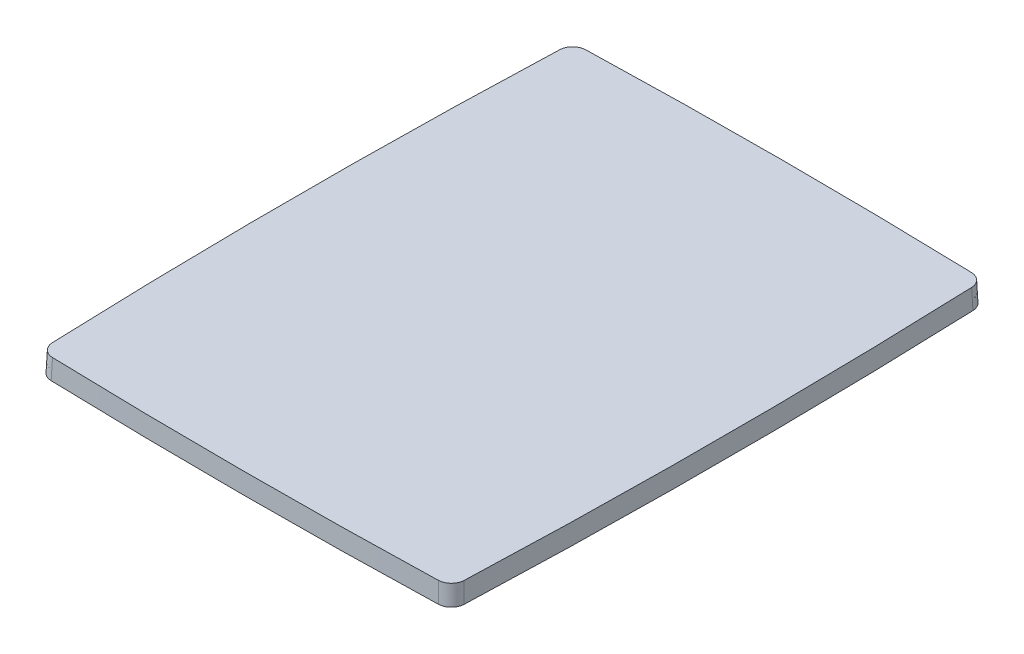
ISO-10303-21;
HEADER;
FILE_DESCRIPTION(('STEP AP214'),'2;1');
FILE_NAME('part.step','',(''),(''),'','','');
FILE_SCHEMA(('AUTOMOTIVE_DESIGN { 1 0 10303 214 1 1 1 1 }'));
ENDSEC;
DATA;
#1=APPLICATION_CONTEXT('core data for automotive mechanical design processes');
#2=APPLICATION_PROTOCOL_DEFINITION('international standard','automotive_design',2000,#1);
#3=PRODUCT_CONTEXT('',#1,'mechanical');
#4=PRODUCT('Part','Part','',(#3));
#5=PRODUCT_RELATED_PRODUCT_CATEGORY('part','',(#4));
#6=PRODUCT_DEFINITION_FORMATION('','',#4);
#7=PRODUCT_DEFINITION_CONTEXT('part definition',#1,'design');
#8=PRODUCT_DEFINITION('design','',#6,#7);
#9=PRODUCT_DEFINITION_SHAPE('','',#8);
#10=(LENGTH_UNIT() NAMED_UNIT(*) SI_UNIT(.MILLI.,.METRE.));
#11=(NAMED_UNIT(*) PLANE_ANGLE_UNIT() SI_UNIT($,.RADIAN.));
#12=(NAMED_UNIT(*) SI_UNIT($,.STERADIAN.) SOLID_ANGLE_UNIT());
#13=UNCERTAINTY_MEASURE_WITH_UNIT(LENGTH_MEASURE(1.E-05),#10,'distance_accuracy_value','');
#14=(GEOMETRIC_REPRESENTATION_CONTEXT(3) GLOBAL_UNCERTAINTY_ASSIGNED_CONTEXT((#13)) GLOBAL_UNIT_ASSIGNED_CONTEXT((#10,
#11,#12)) REPRESENTATION_CONTEXT('',''));
#15=CARTESIAN_POINT('',(0.,0.,0.));
#16=DIRECTION('',(0.,0.,1.));
#17=DIRECTION('',(1.,0.,0.));
#18=AXIS2_PLACEMENT_3D('',#15,#16,#17);
#19=CARTESIAN_POINT('',(0.,0.,475.82));
#20=DIRECTION('',(0.,-1.,0.));
#21=DIRECTION('',(0.,0.,1.));
#22=AXIS2_PLACEMENT_3D('',#19,#20,#21);
#23=CONICAL_SURFACE('',#22,496.,0.0349065850398866);
#24=CARTESIAN_POINT('',(0.,1.5,475.82));
#25=DIRECTION('',(0.,1.,0.));
#26=DIRECTION('',(0.,0.,1.));
#27=AXIS2_PLACEMENT_3D('',#24,#25,#26);
#28=CIRCLE('',#27,495.947618845762);
#29=CARTESIAN_POINT('',(14.4155592053351,1.5,-19.9180682291598));
#30=VERTEX_POINT('',#29);
#31=CARTESIAN_POINT('',(-14.415559205335,1.5,-19.9180682291598));
#32=VERTEX_POINT('',#31);
#33=EDGE_CURVE('E134',#30,#32,#28,.T.);
#34=ORIENTED_EDGE('',*,*,#33,.F.);
#35=CARTESIAN_POINT('',(13.5023841720723,57.3634951500784,-17.0533460126451));
#36=CARTESIAN_POINT('',(13.4688479934822,57.3943815495132,-17.9929902199785));
#37=CARTESIAN_POINT('',(12.5289359465911,57.3634951500784,-18.0179152226585));
#38=CARTESIAN_POINT('',(13.8211198631584,47.9229065522577,-17.375666699754));
#39=CARTESIAN_POINT('',(13.7868473241712,47.959297928233,-18.3139167859002));
#40=CARTESIAN_POINT('',(12.8483225928231,47.9229065522577,-18.3395908921133));
#41=CARTESIAN_POINT('',(14.1395720900963,38.4822986723283,-17.6977000087956));
#42=CARTESIAN_POINT('',(14.1047569560554,38.5185669434554,-18.6347528273251));
#43=CARTESIAN_POINT('',(13.1674244703757,38.4822986723283,-18.6609804761328));
#44=CARTESIAN_POINT('',(14.7759159168737,19.6010449078014,-18.3411982454393));
#45=CARTESIAN_POINT('',(14.7400194638885,19.6371534748343,-19.2758630292112));
#46=CARTESIAN_POINT('',(13.8050650048137,19.6010449078014,-19.3031938326454));
#47=CARTESIAN_POINT('',(15.0938075167173,10.1603990232041,-18.6626631730455));
#48=CARTESIAN_POINT('',(15.0573758785474,10.1963851340502,-19.5961407609568));
#49=CARTESIAN_POINT('',(14.1236036617029,10.1603990232041,-19.6240176051424));
#50=CARTESIAN_POINT('',(15.7290363948796,-8.72093032069853,-19.3050310259384));
#51=CARTESIAN_POINT('',(15.6915381180894,-8.68510230801318,-20.2361405664043));
#52=CARTESIAN_POINT('',(14.7601240758893,-8.72093032069852,-20.265105702369));
#53=CARTESIAN_POINT('',(16.0463736731985,-18.1616137800039,-19.6259339512252));
#54=CARTESIAN_POINT('',(16.0083474255404,-18.1259061405192,-20.5558661547318));
#55=CARTESIAN_POINT('',(15.0781058331865,-18.1616137800039,-20.5853700270988));
#56=CARTESIAN_POINT('',(16.6805000580181,-37.0430178599246,-20.2671840211138));
#57=CARTESIAN_POINT('',(16.6414216044739,-37.0074667166142,-21.1947678837972));
#58=CARTESIAN_POINT('',(15.7135186132139,-37.0430178599246,-21.2253454352469));
#59=CARTESIAN_POINT('',(16.9972891645149,-46.4837384805401,-20.5875311657118));
#60=CARTESIAN_POINT('',(16.9576899037424,-46.448307090399,-21.5139474838743));
#61=CARTESIAN_POINT('',(16.0309496359401,-46.4837384805401,-21.5450565186615));
#62=CARTESIAN_POINT('',(17.3138072577306,-55.9244774089696,-20.9076035285343));
#63=CARTESIAN_POINT('',(17.2738689794106,-55.8945015052294,-21.8330370390336));
#64=CARTESIAN_POINT('',(16.3481083716655,-55.9244774089696,-21.8644940824025));
#65=(BOUNDED_SURFACE() B_SPLINE_SURFACE(3,2,((#35,#36,#37),(#38,#39,#40),(#41,#42,#43),(#44,#45,
#46),(#47,#48,#49),(#50,#51,#52),(#53,#54,#55),(#56,#57,#58),(#59,#60,#61),(#62,#63,#64)),
.UNSPECIFIED.,.F.,.F.,.F.) B_SPLINE_SURFACE_WITH_KNOTS((4,2,2,2,4),(3,3),(0.,28.3543337658623,
56.708667335095,85.0630009002829,113.4173346621),(0.,1.),
.UNSPECIFIED.) GEOMETRIC_REPRESENTATION_ITEM() RATIONAL_B_SPLINE_SURFACE(((1.,0.728355131684002,
1.),(1.,0.728786183443343,1.),(1.,0.729215556511889,1.),(1.,0.73007098314536,1.),(1.,
0.730497036710308,1.),(1.,0.731345862220471,1.),(1.,0.731768634165687,1.),(1.,0.732610933427498,
1.),(1.,0.73303046074407,1.),(1.,0.733448384238914,1.))) REPRESENTATION_ITEM('') SURFACE());
#66=CARTESIAN_POINT('',(12.5289359465911,57.3634951500784,-18.0179152226585));
#67=CARTESIAN_POINT('',(12.8483225928231,47.9229065522577,-18.3395908921133));
#68=CARTESIAN_POINT('',(13.1674244703757,38.4822986723283,-18.6609804761328));
#69=CARTESIAN_POINT('',(13.8050650048137,19.6010449078014,-19.3031938326454));
#70=CARTESIAN_POINT('',(14.1236036617029,10.1603990232041,-19.6240176051424));
#71=CARTESIAN_POINT('',(14.7601240758893,-8.72093032069853,-20.265105702369));
#72=CARTESIAN_POINT('',(15.0781058331865,-18.1616137800039,-20.5853700270988));
#73=CARTESIAN_POINT('',(15.7135186132139,-37.0430178599246,-21.2253454352469));
#74=CARTESIAN_POINT('',(16.0309496359401,-46.4837384805401,-21.5450565186615));
#75=CARTESIAN_POINT('',(16.3481083716655,-55.9244774089696,-21.8644940824025));
#76=B_SPLINE_CURVE_WITH_KNOTS('',3,(#66,#67,#68,#69,#70,#71,#72,#73,#74,#75),.UNSPECIFIED.,.F.,
.F.,(4,2,2,2,4),(0.,28.3543337658623,56.708667335095,85.0630009002829,113.4173346621),.UNSPECIFIED.);
#77=CARTESIAN_POINT('',(14.4661267472598,0.,-19.9689986445163));
#78=VERTEX_POINT('',#77);
#79=EDGE_CURVE('E11',#30,#78,#76,.T.);
#80=ORIENTED_EDGE('',*,*,#79,.T.);
#81=CARTESIAN_POINT('',(0.,0.,475.82));
#82=DIRECTION('',(0.,1.,0.));
#83=DIRECTION('',(0.,0.,1.));
#84=AXIS2_PLACEMENT_3D('',#81,#82,#83);
#85=CIRCLE('',#84,496.);
#86=CARTESIAN_POINT('',(-14.4661267472598,0.,-19.9689986445163));
#87=VERTEX_POINT('',#86);
#88=EDGE_CURVE('E136',#78,#87,#85,.T.);
#89=ORIENTED_EDGE('',*,*,#88,.T.);
#90=CARTESIAN_POINT('',(-12.5289359465911,57.3634951500784,-18.0179152226585));
#91=CARTESIAN_POINT('',(-13.4688479934823,57.3943815495132,-17.9929902199785));
#92=CARTESIAN_POINT('',(-13.5023841720723,57.3634951500784,-17.0533460126451));
#93=CARTESIAN_POINT('',(-12.8483225928231,47.9229065522577,-18.3395908921133));
#94=CARTESIAN_POINT('',(-13.7868473241712,47.959297928233,-18.3139167859001));
#95=CARTESIAN_POINT('',(-13.8211198631584,47.9229065522577,-17.375666699754));
#96=CARTESIAN_POINT('',(-13.1674244703757,38.4822986723283,-18.6609804761328));
#97=CARTESIAN_POINT('',(-14.1047569560554,38.5185669434554,-18.6347528273251));
#98=CARTESIAN_POINT('',(-14.1395720900963,38.4822986723283,-17.6977000087955));
#99=CARTESIAN_POINT('',(-13.8050650048137,19.6010449078014,-19.3031938326454));
#100=CARTESIAN_POINT('',(-14.7400194638885,19.6371534748343,-19.2758630292112));
#101=CARTESIAN_POINT('',(-14.7759159168738,19.6010449078014,-18.3411982454393));
#102=CARTESIAN_POINT('',(-14.1236036617029,10.1603990232041,-19.6240176051424));
#103=CARTESIAN_POINT('',(-15.0573758785474,10.1963851340502,-19.5961407609568));
#104=CARTESIAN_POINT('',(-15.0938075167173,10.1603990232041,-18.6626631730455));
#105=CARTESIAN_POINT('',(-14.7601240758893,-8.72093032069852,-20.265105702369));
#106=CARTESIAN_POINT('',(-15.6915381180894,-8.68510230801318,-20.2361405664043));
#107=CARTESIAN_POINT('',(-15.7290363948796,-8.72093032069852,-19.3050310259384));
#108=CARTESIAN_POINT('',(-15.0781058331865,-18.1616137800039,-20.5853700270988));
#109=CARTESIAN_POINT('',(-16.0083474255404,-18.1259061405191,-20.5558661547318));
#110=CARTESIAN_POINT('',(-16.0463736731985,-18.1616137800039,-19.6259339512252));
#111=CARTESIAN_POINT('',(-15.7135186132139,-37.0430178599246,-21.2253454352469));
#112=CARTESIAN_POINT('',(-16.6414216044739,-37.0074667166142,-21.1947678837972));
#113=CARTESIAN_POINT('',(-16.6805000580181,-37.0430178599246,-20.2671840211138));
#114=CARTESIAN_POINT('',(-16.0309496359401,-46.4837384805401,-21.5450565186615));
#115=CARTESIAN_POINT('',(-16.9576899037424,-46.448307090399,-21.5139474838743));
#116=CARTESIAN_POINT('',(-16.9972891645149,-46.4837384805401,-20.5875311657118));
#117=CARTESIAN_POINT('',(-16.3481083716655,-55.9244774089696,-21.8644940824025));
#118=CARTESIAN_POINT('',(-17.2738689794106,-55.8945015052293,-21.8330370390336));
#119=CARTESIAN_POINT('',(-17.3138072577306,-55.9244774089696,-20.9076035285343));
#120=(BOUNDED_SURFACE() B_SPLINE_SURFACE(3,2,((#90,#91,#92),(#93,#94,#95),(#96,#97,#98),(#99,
#100,#101),(#102,#103,#104),(#105,#106,#107),(#108,#109,#110),(#111,#112,#113),(#114,#115,#116),
(#117,#118,#119)),.UNSPECIFIED.,.F.,.F.,.F.) B_SPLINE_SURFACE_WITH_KNOTS((4,2,2,2,4),(3,3),(0.,
28.3543337658623,56.7086673350949,85.0630009002828,113.4173346621),(0.,1.),
.UNSPECIFIED.) GEOMETRIC_REPRESENTATION_ITEM() RATIONAL_B_SPLINE_SURFACE(((1.,0.728355131684002,
1.),(1.,0.728786183443343,1.),(1.,0.729215556511889,1.),(1.,0.73007098314536,1.),(1.,
0.730497036710308,1.),(1.,0.731345862220471,1.),(1.,0.731768634165687,1.),(1.,0.732610933427498,
1.),(1.,0.73303046074407,1.),(1.,0.733448384238914,1.))) REPRESENTATION_ITEM('') SURFACE());
#121=CARTESIAN_POINT('',(-16.3481083716655,-55.9244774089696,-21.8644940824025));
#122=CARTESIAN_POINT('',(-16.0309496359401,-46.48373848054,-21.5450565186615));
#123=CARTESIAN_POINT('',(-15.7135186132139,-37.0430178599245,-21.2253454352469));
#124=CARTESIAN_POINT('',(-15.0781058331865,-18.1616137800039,-20.5853700270988));
#125=CARTESIAN_POINT('',(-14.7601240758893,-8.72093032069853,-20.265105702369));
#126=CARTESIAN_POINT('',(-14.1236036617029,10.1603990232041,-19.6240176051424));
#127=CARTESIAN_POINT('',(-13.8050650048137,19.6010449078014,-19.3031938326454));
#128=CARTESIAN_POINT('',(-13.1674244703758,38.4822986723283,-18.6609804761328));
#129=CARTESIAN_POINT('',(-12.8483225928231,47.9229065522577,-18.3395908921133));
#130=CARTESIAN_POINT('',(-12.5289359465911,57.3634951500784,-18.0179152226585));
#131=B_SPLINE_CURVE_WITH_KNOTS('',3,(#121,#122,#123,#124,#125,#126,#127,#128,#129,#130),
.UNSPECIFIED.,.F.,.F.,(4,2,2,2,4),(0.,28.3543337618174,56.7086673270053,85.0630008962379,
113.4173346621),.UNSPECIFIED.);
#132=EDGE_CURVE('E46',#87,#32,#131,.T.);
#133=ORIENTED_EDGE('',*,*,#132,.T.);
#134=EDGE_LOOP('',(#34,#80,#89,#133));
#135=FACE_BOUND('',#134,.T.);
#136=ADVANCED_FACE('F33',(#135),#23,.T.);
#137=CARTESIAN_POINT('',(480.2,0.,0.));
#138=DIRECTION('',(0.,-1.,0.));
#139=DIRECTION('',(0.,0.,1.));
#140=AXIS2_PLACEMENT_3D('',#137,#138,#139);
#141=CONICAL_SURFACE('',#140,496.,0.0349065850398866);
#142=CARTESIAN_POINT('',(480.2,0.,0.));
#143=DIRECTION('',(0.,1.,0.));
#144=DIRECTION('',(0.,0.,1.));
#145=AXIS2_PLACEMENT_3D('',#142,#143,#144);
#146=CIRCLE('',#145,496.);
#147=CARTESIAN_POINT('',(-15.4356356049083,0.,-19.0083328705757));
#148=VERTEX_POINT('',#147);
#149=CARTESIAN_POINT('',(-15.4356356049082,0.,19.0083328705757));
#150=VERTEX_POINT('',#149);
#151=EDGE_CURVE('E132',#148,#150,#146,.T.);
#152=ORIENTED_EDGE('',*,*,#151,.T.);
#153=CARTESIAN_POINT('',(-13.5023841720723,57.3634951500785,17.0533460126451));
#154=CARTESIAN_POINT('',(-13.4688479934822,57.3943815495133,17.9929902199785));
#155=CARTESIAN_POINT('',(-12.5289359465911,57.3634951500785,18.0179152226585));
#156=CARTESIAN_POINT('',(-13.8211198631585,47.9229065522578,17.375666699754));
#157=CARTESIAN_POINT('',(-13.7868473241712,47.9592979282331,18.3139167859002));
#158=CARTESIAN_POINT('',(-12.8483225928231,47.9229065522577,18.3395908921133));
#159=CARTESIAN_POINT('',(-14.1395720900963,38.4822986723284,17.6977000087955));
#160=CARTESIAN_POINT('',(-14.1047569560554,38.5185669434554,18.6347528273251));
#161=CARTESIAN_POINT('',(-13.1674244703757,38.4822986723284,18.6609804761329));
#162=CARTESIAN_POINT('',(-14.7759159168737,19.6010449078014,18.3411982454393));
#163=CARTESIAN_POINT('',(-14.7400194638885,19.6371534748343,19.2758630292112));
#164=CARTESIAN_POINT('',(-13.8050650048137,19.6010449078014,19.3031938326454));
#165=CARTESIAN_POINT('',(-15.0938075167172,10.1603990232042,18.6626631730455));
#166=CARTESIAN_POINT('',(-15.0573758785474,10.1963851340502,19.5961407609568));
#167=CARTESIAN_POINT('',(-14.1236036617029,10.1603990232042,19.6240176051424));
#168=CARTESIAN_POINT('',(-15.7290363948796,-8.72093032069853,19.3050310259384));
#169=CARTESIAN_POINT('',(-15.6915381180894,-8.68510230801318,20.2361405664044));
#170=CARTESIAN_POINT('',(-14.7601240758893,-8.72093032069852,20.265105702369));
#171=CARTESIAN_POINT('',(-16.0463736731985,-18.1616137800039,19.6259339512252));
#172=CARTESIAN_POINT('',(-16.0083474255404,-18.1259061405191,20.5558661547318));
#173=CARTESIAN_POINT('',(-15.0781058331866,-18.1616137800039,20.5853700270988));
#174=CARTESIAN_POINT('',(-16.6805000580181,-37.0430178599246,20.2671840211138));
#175=CARTESIAN_POINT('',(-16.641421604474,-37.0074667166143,21.1947678837972));
#176=CARTESIAN_POINT('',(-15.7135186132139,-37.0430178599246,21.2253454352469));
#177=CARTESIAN_POINT('',(-16.9972891645149,-46.4837384805402,20.5875311657118));
#178=CARTESIAN_POINT('',(-16.9576899037424,-46.4483070903991,21.5139474838743));
#179=CARTESIAN_POINT('',(-16.0309496359402,-46.4837384805402,21.5450565186615));
#180=CARTESIAN_POINT('',(-17.3138072577305,-55.9244774089697,20.9076035285344));
#181=CARTESIAN_POINT('',(-17.2738689794106,-55.8945015052294,21.8330370390336));
#182=CARTESIAN_POINT('',(-16.3481083716655,-55.9244774089697,21.8644940824025));
#183=(BOUNDED_SURFACE() B_SPLINE_SURFACE(3,2,((#153,#154,#155),(#156,#157,#158),(#159,#160,
#161),(#162,#163,#164),(#165,#166,#167),(#168,#169,#170),(#171,#172,#173),(#174,#175,#176),
(#177,#178,#179),(#180,#181,#182)),.UNSPECIFIED.,.F.,.F.,.F.) B_SPLINE_SURFACE_WITH_KNOTS((4,2,
2,2,4),(3,3),(0.,28.3543337658623,56.708667335095,85.0630009002829,113.4173346621),(0.,1.),
.UNSPECIFIED.) GEOMETRIC_REPRESENTATION_ITEM() RATIONAL_B_SPLINE_SURFACE(((1.,0.728355131684002,
1.),(1.,0.728786183443344,1.),(1.,0.72921555651189,1.),(1.,0.73007098314536,1.),(1.,
0.730497036710308,1.),(1.,0.731345862220471,1.),(1.,0.731768634165687,1.),(1.,0.732610933427498,
1.),(1.,0.73303046074407,1.),(1.,0.733448384238915,1.))) REPRESENTATION_ITEM('') SURFACE());
#184=CARTESIAN_POINT('',(-17.3138072577305,-55.9244774089697,20.9076035285344));
#185=CARTESIAN_POINT('',(-16.9972891645149,-46.4837384805401,20.5875311657118));
#186=CARTESIAN_POINT('',(-16.6805000580181,-37.0430178599246,20.2671840211138));
#187=CARTESIAN_POINT('',(-16.0463736731985,-18.1616137800039,19.6259339512252));
#188=CARTESIAN_POINT('',(-15.7290363948796,-8.72093032069853,19.3050310259384));
#189=CARTESIAN_POINT('',(-15.0938075167172,10.1603990232042,18.6626631730455));
#190=CARTESIAN_POINT('',(-14.7759159168737,19.6010449078014,18.3411982454393));
#191=CARTESIAN_POINT('',(-14.1395720900963,38.4822986723284,17.6977000087955));
#192=CARTESIAN_POINT('',(-13.8211198631585,47.9229065522578,17.375666699754));
#193=CARTESIAN_POINT('',(-13.5023841720723,57.3634951500785,17.0533460126451));
#194=B_SPLINE_CURVE_WITH_KNOTS('',3,(#184,#185,#186,#187,#188,#189,#190,#191,#192,#193),
.UNSPECIFIED.,.F.,.F.,(4,2,2,2,4),(0.,28.3543337618175,56.7086673270054,85.0630008962381,
113.4173346621),.UNSPECIFIED.);
#195=CARTESIAN_POINT('',(-15.3851706676402,1.5,18.95730078644));
#196=VERTEX_POINT('',#195);
#197=EDGE_CURVE('E111',#150,#196,#194,.T.);
#198=ORIENTED_EDGE('',*,*,#197,.T.);
#199=CARTESIAN_POINT('',(480.2,1.5,0.));
#200=DIRECTION('',(0.,1.,0.));
#201=DIRECTION('',(0.,0.,1.));
#202=AXIS2_PLACEMENT_3D('',#199,#200,#201);
#203=CIRCLE('',#202,495.947618845762);
#204=CARTESIAN_POINT('',(-15.3851706676402,1.5,-18.95730078644));
#205=VERTEX_POINT('',#204);
#206=EDGE_CURVE('E142',#205,#196,#203,.T.);
#207=ORIENTED_EDGE('',*,*,#206,.F.);
#208=CARTESIAN_POINT('',(-13.5023841720723,57.3634951500784,-17.0533460126451));
#209=CARTESIAN_POINT('',(-13.8211198631584,47.9229065522577,-17.375666699754));
#210=CARTESIAN_POINT('',(-14.1395720900963,38.4822986723283,-17.6977000087955));
#211=CARTESIAN_POINT('',(-14.7759159168738,19.6010449078014,-18.3411982454393));
#212=CARTESIAN_POINT('',(-15.0938075167173,10.1603990232041,-18.6626631730455));
#213=CARTESIAN_POINT('',(-15.7290363948796,-8.72093032069853,-19.3050310259384));
#214=CARTESIAN_POINT('',(-16.0463736731985,-18.1616137800039,-19.6259339512252));
#215=CARTESIAN_POINT('',(-16.6805000580181,-37.0430178599246,-20.2671840211138));
#216=CARTESIAN_POINT('',(-16.9972891645149,-46.48373848054,-20.5875311657118));
#217=CARTESIAN_POINT('',(-17.3138072577306,-55.9244774089696,-20.9076035285343));
#218=B_SPLINE_CURVE_WITH_KNOTS('',3,(#208,#209,#210,#211,#212,#213,#214,#215,#216,#217),
.UNSPECIFIED.,.F.,.F.,(4,2,2,2,4),(0.,28.3543337658623,56.7086673350949,85.0630009002828,
113.4173346621),.UNSPECIFIED.);
#219=EDGE_CURVE('E116',#205,#148,#218,.T.);
#220=ORIENTED_EDGE('',*,*,#219,.T.);
#221=EDGE_LOOP('',(#152,#198,#207,#220));
#222=FACE_BOUND('',#221,.T.);
#223=ADVANCED_FACE('F215',(#222),#141,.T.);
#224=CARTESIAN_POINT('',(0.,0.,-475.82));
#225=DIRECTION('',(0.,-1.,0.));
#226=DIRECTION('',(0.,0.,-1.));
#227=AXIS2_PLACEMENT_3D('',#224,#225,#226);
#228=CONICAL_SURFACE('',#227,496.,0.0349065850398866);
#229=CARTESIAN_POINT('',(0.,1.5,-475.82));
#230=DIRECTION('',(0.,1.,0.));
#231=DIRECTION('',(0.,0.,1.));
#232=AXIS2_PLACEMENT_3D('',#229,#230,#231);
#233=CIRCLE('',#232,495.947618845762);
#234=CARTESIAN_POINT('',(-14.4155592053351,1.5,19.9180682291598));
#235=VERTEX_POINT('',#234);
#236=CARTESIAN_POINT('',(14.415559205335,1.5,19.9180682291598));
#237=VERTEX_POINT('',#236);
#238=EDGE_CURVE('E125',#235,#237,#233,.T.);
#239=ORIENTED_EDGE('',*,*,#238,.F.);
#240=CARTESIAN_POINT('',(-12.5289359465911,57.3634951500785,18.0179152226585));
#241=CARTESIAN_POINT('',(-12.8483225928231,47.9229065522578,18.3395908921133));
#242=CARTESIAN_POINT('',(-13.1674244703757,38.4822986723284,18.6609804761329));
#243=CARTESIAN_POINT('',(-13.8050650048137,19.6010449078014,19.3031938326454));
#244=CARTESIAN_POINT('',(-14.1236036617029,10.1603990232042,19.6240176051424));
#245=CARTESIAN_POINT('',(-14.7601240758893,-8.72093032069853,20.265105702369));
#246=CARTESIAN_POINT('',(-15.0781058331866,-18.1616137800039,20.5853700270988));
#247=CARTESIAN_POINT('',(-15.7135186132139,-37.0430178599246,21.2253454352469));
#248=CARTESIAN_POINT('',(-16.0309496359402,-46.4837384805401,21.5450565186615));
#249=CARTESIAN_POINT('',(-16.3481083716655,-55.9244774089697,21.8644940824025));
#250=B_SPLINE_CURVE_WITH_KNOTS('',3,(#240,#241,#242,#243,#244,#245,#246,#247,#248,#249),
.UNSPECIFIED.,.F.,.F.,(4,2,2,2,4),(0.,28.3543337658623,56.708667335095,85.0630009002829,
113.4173346621),.UNSPECIFIED.);
#251=CARTESIAN_POINT('',(-14.4661267472598,0.,19.9689986445163));
#252=VERTEX_POINT('',#251);
#253=EDGE_CURVE('E110',#235,#252,#250,.T.);
#254=ORIENTED_EDGE('',*,*,#253,.T.);
#255=CARTESIAN_POINT('',(0.,0.,-475.82));
#256=DIRECTION('',(0.,1.,0.));
#257=DIRECTION('',(0.,0.,-1.));
#258=AXIS2_PLACEMENT_3D('',#255,#256,#257);
#259=CIRCLE('',#258,496.);
#260=CARTESIAN_POINT('',(14.4661267472598,0.,19.9689986445163));
#261=VERTEX_POINT('',#260);
#262=EDGE_CURVE('E123',#252,#261,#259,.T.);
#263=ORIENTED_EDGE('',*,*,#262,.T.);
#264=CARTESIAN_POINT('',(12.5289359465911,57.3634951500784,18.0179152226585));
#265=CARTESIAN_POINT('',(13.4688479934822,57.3943815495132,17.9929902199785));
#266=CARTESIAN_POINT('',(13.5023841720723,57.3634951500784,17.0533460126451));
#267=CARTESIAN_POINT('',(12.8483225928231,47.9229065522577,18.3395908921133));
#268=CARTESIAN_POINT('',(13.7868473241712,47.959297928233,18.3139167859002));
#269=CARTESIAN_POINT('',(13.8211198631585,47.9229065522577,17.375666699754));
#270=CARTESIAN_POINT('',(13.1674244703757,38.4822986723283,18.6609804761329));
#271=CARTESIAN_POINT('',(14.1047569560554,38.5185669434554,18.6347528273251));
#272=CARTESIAN_POINT('',(14.1395720900963,38.4822986723283,17.6977000087955));
#273=CARTESIAN_POINT('',(13.8050650048137,19.6010449078014,19.3031938326455));
#274=CARTESIAN_POINT('',(14.7400194638885,19.6371534748343,19.2758630292112));
#275=CARTESIAN_POINT('',(14.7759159168737,19.6010449078014,18.3411982454393));
#276=CARTESIAN_POINT('',(14.1236036617029,10.1603990232041,19.6240176051424));
#277=CARTESIAN_POINT('',(15.0573758785474,10.1963851340502,19.5961407609568));
#278=CARTESIAN_POINT('',(15.0938075167172,10.1603990232041,18.6626631730455));
#279=CARTESIAN_POINT('',(14.7601240758893,-8.72093032069852,20.265105702369));
#280=CARTESIAN_POINT('',(15.6915381180894,-8.68510230801318,20.2361405664044));
#281=CARTESIAN_POINT('',(15.7290363948796,-8.72093032069852,19.3050310259384));
#282=CARTESIAN_POINT('',(15.0781058331866,-18.1616137800039,20.5853700270987));
#283=CARTESIAN_POINT('',(16.0083474255404,-18.1259061405191,20.5558661547318));
#284=CARTESIAN_POINT('',(16.0463736731985,-18.1616137800039,19.6259339512252));
#285=CARTESIAN_POINT('',(15.7135186132139,-37.0430178599246,21.2253454352469));
#286=CARTESIAN_POINT('',(16.641421604474,-37.0074667166142,21.1947678837972));
#287=CARTESIAN_POINT('',(16.6805000580181,-37.0430178599246,20.2671840211138));
#288=CARTESIAN_POINT('',(16.0309496359402,-46.4837384805401,21.5450565186614));
#289=CARTESIAN_POINT('',(16.9576899037424,-46.448307090399,21.5139474838743));
#290=CARTESIAN_POINT('',(16.9972891645149,-46.4837384805401,20.5875311657118));
#291=CARTESIAN_POINT('',(16.3481083716655,-55.9244774089696,21.8644940824025));
#292=CARTESIAN_POINT('',(17.2738689794106,-55.8945015052294,21.8330370390336));
#293=CARTESIAN_POINT('',(17.3138072577306,-55.9244774089696,20.9076035285344));
#294=(BOUNDED_SURFACE() B_SPLINE_SURFACE(3,2,((#264,#265,#266),(#267,#268,#269),(#270,#271,
#272),(#273,#274,#275),(#276,#277,#278),(#279,#280,#281),(#282,#283,#284),(#285,#286,#287),
(#288,#289,#290),(#291,#292,#293)),.UNSPECIFIED.,.F.,.F.,.F.) B_SPLINE_SURFACE_WITH_KNOTS((4,2,
2,2,4),(3,3),(0.,28.3543337658623,56.7086673350949,85.0630009002828,113.4173346621),(0.,1.),
.UNSPECIFIED.) GEOMETRIC_REPRESENTATION_ITEM() RATIONAL_B_SPLINE_SURFACE(((1.,0.728355131684002,
1.),(1.,0.728786183443344,1.),(1.,0.72921555651189,1.),(1.,0.73007098314536,1.),(1.,
0.730497036710308,1.),(1.,0.731345862220471,1.),(1.,0.731768634165687,1.),(1.,0.732610933427498,
1.),(1.,0.73303046074407,1.),(1.,0.733448384238914,1.))) REPRESENTATION_ITEM('') SURFACE());
#295=CARTESIAN_POINT('',(16.3481083716655,-55.9244774089696,21.8644940824025));
#296=CARTESIAN_POINT('',(16.0309496359402,-46.4837384805401,21.5450565186614));
#297=CARTESIAN_POINT('',(15.7135186132139,-37.0430178599246,21.2253454352469));
#298=CARTESIAN_POINT('',(15.0781058331866,-18.1616137800039,20.5853700270987));
#299=CARTESIAN_POINT('',(14.7601240758893,-8.72093032069852,20.265105702369));
#300=CARTESIAN_POINT('',(14.1236036617029,10.1603990232041,19.6240176051424));
#301=CARTESIAN_POINT('',(13.8050650048137,19.6010449078014,19.3031938326455));
#302=CARTESIAN_POINT('',(13.1674244703757,38.4822986723283,18.6609804761329));
#303=CARTESIAN_POINT('',(12.8483225928231,47.9229065522577,18.3395908921133));
#304=CARTESIAN_POINT('',(12.5289359465911,57.3634951500784,18.0179152226585));
#305=B_SPLINE_CURVE_WITH_KNOTS('',3,(#295,#296,#297,#298,#299,#300,#301,#302,#303,#304),
.UNSPECIFIED.,.F.,.F.,(4,2,2,2,4),(0.,28.3543337618174,56.7086673270053,85.063000896238,
113.4173346621),.UNSPECIFIED.);
#306=EDGE_CURVE('E127',#261,#237,#305,.T.);
#307=ORIENTED_EDGE('',*,*,#306,.T.);
#308=EDGE_LOOP('',(#239,#254,#263,#307));
#309=FACE_BOUND('',#308,.T.);
#310=ADVANCED_FACE('F122',(#309),#228,.T.);
#311=CARTESIAN_POINT('',(-480.2,0.,0.));
#312=DIRECTION('',(0.,-1.,0.));
#313=DIRECTION('',(0.,0.,-1.));
#314=AXIS2_PLACEMENT_3D('',#311,#312,#313);
#315=CONICAL_SURFACE('',#314,496.,0.0349065850398866);
#316=CARTESIAN_POINT('',(-480.2,1.5,0.));
#317=DIRECTION('',(0.,1.,0.));
#318=DIRECTION('',(0.,0.,1.));
#319=AXIS2_PLACEMENT_3D('',#316,#317,#318);
#320=CIRCLE('',#319,495.947618845762);
#321=CARTESIAN_POINT('',(15.3851706676402,1.5,18.95730078644));
#322=VERTEX_POINT('',#321);
#323=CARTESIAN_POINT('',(15.3851706676402,1.5,-18.95730078644));
#324=VERTEX_POINT('',#323);
#325=EDGE_CURVE('E146',#322,#324,#320,.T.);
#326=ORIENTED_EDGE('',*,*,#325,.F.);
#327=CARTESIAN_POINT('',(13.5023841720723,57.3634951500784,17.0533460126451));
#328=CARTESIAN_POINT('',(13.8211198631585,47.9229065522577,17.375666699754));
#329=CARTESIAN_POINT('',(14.1395720900963,38.4822986723283,17.6977000087955));
#330=CARTESIAN_POINT('',(14.7759159168737,19.6010449078014,18.3411982454393));
#331=CARTESIAN_POINT('',(15.0938075167172,10.1603990232041,18.6626631730455));
#332=CARTESIAN_POINT('',(15.7290363948796,-8.72093032069852,19.3050310259384));
#333=CARTESIAN_POINT('',(16.0463736731985,-18.1616137800039,19.6259339512252));
#334=CARTESIAN_POINT('',(16.6805000580181,-37.0430178599246,20.2671840211138));
#335=CARTESIAN_POINT('',(16.9972891645149,-46.4837384805401,20.5875311657118));
#336=CARTESIAN_POINT('',(17.3138072577306,-55.9244774089696,20.9076035285344));
#337=B_SPLINE_CURVE_WITH_KNOTS('',3,(#327,#328,#329,#330,#331,#332,#333,#334,#335,#336),
.UNSPECIFIED.,.F.,.F.,(4,2,2,2,4),(0.,28.3543337658623,56.7086673350949,85.0630009002828,
113.4173346621),.UNSPECIFIED.);
#338=CARTESIAN_POINT('',(15.4356356049083,0.,19.0083328705757));
#339=VERTEX_POINT('',#338);
#340=EDGE_CURVE('E305',#322,#339,#337,.T.);
#341=ORIENTED_EDGE('',*,*,#340,.T.);
#342=CARTESIAN_POINT('',(-480.2,0.,0.));
#343=DIRECTION('',(0.,1.,0.));
#344=DIRECTION('',(0.,0.,-1.));
#345=AXIS2_PLACEMENT_3D('',#342,#343,#344);
#346=CIRCLE('',#345,496.);
#347=CARTESIAN_POINT('',(15.4356356049082,0.,-19.0083328705758));
#348=VERTEX_POINT('',#347);
#349=EDGE_CURVE('E131',#339,#348,#346,.T.);
#350=ORIENTED_EDGE('',*,*,#349,.T.);
#351=CARTESIAN_POINT('',(17.3138072577306,-55.9244774089696,-20.9076035285343));
#352=CARTESIAN_POINT('',(16.9972891645149,-46.4837384805401,-20.5875311657118));
#353=CARTESIAN_POINT('',(16.6805000580181,-37.0430178599246,-20.2671840211138));
#354=CARTESIAN_POINT('',(16.0463736731985,-18.1616137800039,-19.6259339512252));
#355=CARTESIAN_POINT('',(15.7290363948796,-8.72093032069853,-19.3050310259384));
#356=CARTESIAN_POINT('',(15.0938075167173,10.1603990232041,-18.6626631730455));
#357=CARTESIAN_POINT('',(14.7759159168737,19.6010449078014,-18.3411982454393));
#358=CARTESIAN_POINT('',(14.1395720900963,38.4822986723283,-17.6977000087956));
#359=CARTESIAN_POINT('',(13.8211198631584,47.9229065522577,-17.375666699754));
#360=CARTESIAN_POINT('',(13.5023841720723,57.3634951500784,-17.0533460126451));
#361=B_SPLINE_CURVE_WITH_KNOTS('',3,(#351,#352,#353,#354,#355,#356,#357,#358,#359,#360),
.UNSPECIFIED.,.F.,.F.,(4,2,2,2,4),(0.,28.3543337618174,56.7086673270053,85.063000896238,
113.4173346621),.UNSPECIFIED.);
#362=EDGE_CURVE('E54',#348,#324,#361,.T.);
#363=ORIENTED_EDGE('',*,*,#362,.T.);
#364=EDGE_LOOP('',(#326,#341,#350,#363));
#365=FACE_BOUND('',#364,.T.);
#366=ADVANCED_FACE('F181',(#365),#315,.T.);
#367=CARTESIAN_POINT('',(240.1,1.5,237.91));
#368=DIRECTION('',(0.,1.,0.));
#369=DIRECTION('',(0.,0.,1.));
#370=AXIS2_PLACEMENT_3D('',#367,#368,#369);
#371=PLANE('',#370);
#372=ORIENTED_EDGE('',*,*,#206,.T.);
#373=CARTESIAN_POINT('',(-15.3851706676402,1.5,18.95730078644));
#374=CARTESIAN_POINT('',(-15.3840954488534,1.5,18.9854044182334));
#375=CARTESIAN_POINT('',(-15.3818353233353,1.5,19.0134492940667));
#376=CARTESIAN_POINT('',(-15.3749633940711,1.5,19.0692481670319));
#377=CARTESIAN_POINT('',(-15.3703516909127,1.5,19.0970021765537));
#378=CARTESIAN_POINT('',(-15.3530344561649,1.5,19.179484172744));
#379=CARTESIAN_POINT('',(-15.3368432622391,1.5,19.2335223692106));
#380=CARTESIAN_POINT('',(-15.2956157969693,1.5,19.3381124908574));
#381=CARTESIAN_POINT('',(-15.2705750207214,1.5,19.3886626247357));
#382=CARTESIAN_POINT('',(-15.2123609733563,1.5,19.4848336106056));
#383=CARTESIAN_POINT('',(-15.1791896003578,1.5,19.530455609513));
#384=CARTESIAN_POINT('',(-15.1056787554854,1.5,19.6154484086961));
#385=CARTESIAN_POINT('',(-15.0653439611257,1.5,19.6548232566122));
#386=CARTESIAN_POINT('',(-14.9786187406782,1.5,19.7262549937457));
#387=CARTESIAN_POINT('',(-14.9322262362045,1.5,19.7583093608996));
#388=CARTESIAN_POINT('',(-14.8347168607365,1.5,19.8141773009699));
#389=CARTESIAN_POINT('',(-14.783599104236,1.5,19.837989325299));
#390=CARTESIAN_POINT('',(-14.6781189529367,1.5,19.8766734981228));
#391=CARTESIAN_POINT('',(-14.6237602385146,1.5,19.8915555824727));
#392=CARTESIAN_POINT('',(-14.543320651043,1.5,19.9064551907792));
#393=CARTESIAN_POINT('',(-14.517874551846,1.5,19.9101577858114));
#394=CARTESIAN_POINT('',(-14.4668187000332,1.5,19.9155892527512));
#395=CARTESIAN_POINT('',(-14.441209322899,1.5,19.9173216535295));
#396=CARTESIAN_POINT('',(-14.4155592053351,1.5,19.9180682291597));
#397=B_SPLINE_CURVE_WITH_KNOTS('',3,(#373,#374,#375,#376,#377,#378,#379,#380,#381,#382,#383,
#384,#385,#386,#387,#388,#389,#390,#391,#392,#393,#394,#395,#396),.UNSPECIFIED.,.F.,.F.,(4,2,2,
2,2,2,2,2,2,2,2,4),(0.,0.0843208682622431,0.168638130042223,0.337005165227269,0.505458031857594,
0.673871609921148,0.842175620253475,1.01053752777069,1.1789310503031,1.34713686147911,
1.42421503842258,1.50115493995651),.UNSPECIFIED.);
#398=EDGE_CURVE('E276',#196,#235,#397,.T.);
#399=ORIENTED_EDGE('',*,*,#398,.T.);
#400=ORIENTED_EDGE('',*,*,#238,.T.);
#401=CARTESIAN_POINT('',(14.415559205335,1.5,19.9180682291598));
#402=CARTESIAN_POINT('',(14.443671509368,1.5,19.9172505633519));
#403=CARTESIAN_POINT('',(14.4717359169659,1.5,19.9152475021854));
#404=CARTESIAN_POINT('',(14.527595413619,1.5,19.9088871350843));
#405=CARTESIAN_POINT('',(14.5553905141418,1.5,19.9045299298465));
#406=CARTESIAN_POINT('',(14.6380277220834,1.5,19.8879691877602));
#407=CARTESIAN_POINT('',(14.6922120066699,1.5,19.8722738144937));
#408=CARTESIAN_POINT('',(14.7971754965467,1.5,19.8320064178609));
#409=CARTESIAN_POINT('',(14.8479529518878,1.5,19.8074298733666));
#410=CARTESIAN_POINT('',(14.9446533040018,1.5,19.7500994649007));
#411=CARTESIAN_POINT('',(14.9905773302499,1.5,19.7173475094771));
#412=CARTESIAN_POINT('',(15.0762401263628,1.5,19.6446185222094));
#413=CARTESIAN_POINT('',(15.1159829008386,1.5,19.6046462047709));
#414=CARTESIAN_POINT('',(15.188206284812,1.5,19.5185791394148));
#415=CARTESIAN_POINT('',(15.2206843913956,1.5,19.4724822900895));
#416=CARTESIAN_POINT('',(15.2774434446743,1.5,19.3754889145282));
#417=CARTESIAN_POINT('',(15.3017228509605,1.5,19.3245914886339));
#418=CARTESIAN_POINT('',(15.3413718929473,1.5,19.2194702204969));
#419=CARTESIAN_POINT('',(15.3567514303634,1.5,19.1652501495167));
#420=CARTESIAN_POINT('',(15.3723874647166,1.5,19.0849504609122));
#421=CARTESIAN_POINT('',(15.3763230617296,1.5,19.059539356047));
#422=CARTESIAN_POINT('',(15.3822221150097,1.5,19.0085354149459));
#423=CARTESIAN_POINT('',(15.3841890965586,1.5,18.98294298651));
#424=CARTESIAN_POINT('',(15.3851706676402,1.5,18.95730078644));
#425=B_SPLINE_CURVE_WITH_KNOTS('',3,(#401,#402,#403,#404,#405,#406,#407,#408,#409,#410,#411,
#412,#413,#414,#415,#416,#417,#418,#419,#420,#421,#422,#423,#424),.UNSPECIFIED.,.F.,.F.,(4,2,2,
2,2,2,2,2,2,2,2,4),(0.,0.0843208682621461,0.168638130042029,0.337005165227318,0.5054580318576,
0.673871609921254,0.842175620253542,1.01053752777072,1.17893105030305,1.34713686147916,
1.42421503842259,1.5011549399566),.UNSPECIFIED.);
#426=EDGE_CURVE('E61',#237,#322,#425,.T.);
#427=ORIENTED_EDGE('',*,*,#426,.T.);
#428=ORIENTED_EDGE('',*,*,#325,.T.);
#429=CARTESIAN_POINT('',(15.3851706676402,1.5,-18.95730078644));
#430=CARTESIAN_POINT('',(15.3840954488529,1.5,-18.9854044182332));
#431=CARTESIAN_POINT('',(15.381835323335,1.5,-19.0134492940664));
#432=CARTESIAN_POINT('',(15.3749633940716,1.5,-19.0692481670315));
#433=CARTESIAN_POINT('',(15.3703516909138,1.5,-19.0970021765533));
#434=CARTESIAN_POINT('',(15.3530344561666,1.5,-19.1794841727438));
#435=CARTESIAN_POINT('',(15.3368432622396,1.5,-19.2335223692105));
#436=CARTESIAN_POINT('',(15.2956157969689,1.5,-19.3381124908574));
#437=CARTESIAN_POINT('',(15.2705750207213,1.5,-19.3886626247357));
#438=CARTESIAN_POINT('',(15.2123609733564,1.5,-19.4848336106057));
#439=CARTESIAN_POINT('',(15.1791896003578,1.5,-19.530455609513));
#440=CARTESIAN_POINT('',(15.1056787554854,1.5,-19.6154484086962));
#441=CARTESIAN_POINT('',(15.0653439611257,1.5,-19.6548232566123));
#442=CARTESIAN_POINT('',(14.9786187406782,1.5,-19.7262549937458));
#443=CARTESIAN_POINT('',(14.9322262362044,1.5,-19.7583093608996));
#444=CARTESIAN_POINT('',(14.8347168607364,1.5,-19.81417730097));
#445=CARTESIAN_POINT('',(14.783599104236,1.5,-19.8379893252992));
#446=CARTESIAN_POINT('',(14.6781189529366,1.5,-19.876673498123));
#447=CARTESIAN_POINT('',(14.6237602385145,1.5,-19.8915555824728));
#448=CARTESIAN_POINT('',(14.543320651043,1.5,-19.9064551907792));
#449=CARTESIAN_POINT('',(14.5178745518459,1.5,-19.9101577858114));
#450=CARTESIAN_POINT('',(14.4668187000332,1.5,-19.9155892527512));
#451=CARTESIAN_POINT('',(14.441209322899,1.5,-19.9173216535295));
#452=CARTESIAN_POINT('',(14.415559205335,1.5,-19.9180682291597));
#453=B_SPLINE_CURVE_WITH_KNOTS('',3,(#429,#430,#431,#432,#433,#434,#435,#436,#437,#438,#439,
#440,#441,#442,#443,#444,#445,#446,#447,#448,#449,#450,#451,#452),.UNSPECIFIED.,.F.,.F.,(4,2,2,
2,2,2,2,2,2,2,2,4),(0.,0.0843208682619321,0.168638130041491,0.33700516522745,0.505458031857785,
0.673871609921349,0.84217562025369,1.01053752777092,1.17893105030345,1.34713686147936,
1.42421503842282,1.50115493995673),.UNSPECIFIED.);
#454=EDGE_CURVE('E253',#324,#30,#453,.T.);
#455=ORIENTED_EDGE('',*,*,#454,.T.);
#456=ORIENTED_EDGE('',*,*,#33,.T.);
#457=CARTESIAN_POINT('',(-14.415559205335,1.5,-19.9180682291597));
#458=CARTESIAN_POINT('',(-14.443671509368,1.5,-19.9172505633519));
#459=CARTESIAN_POINT('',(-14.471735916966,1.5,-19.9152475021854));
#460=CARTESIAN_POINT('',(-14.527595413619,1.5,-19.9088871350843));
#461=CARTESIAN_POINT('',(-14.5553905141418,1.5,-19.9045299298465));
#462=CARTESIAN_POINT('',(-14.6380277220835,1.5,-19.8879691877601));
#463=CARTESIAN_POINT('',(-14.69221200667,1.5,-19.8722738144937));
#464=CARTESIAN_POINT('',(-14.7971754965467,1.5,-19.8320064178608));
#465=CARTESIAN_POINT('',(-14.8479529518877,1.5,-19.8074298733662));
#466=CARTESIAN_POINT('',(-14.9446533040017,1.5,-19.7500994649003));
#467=CARTESIAN_POINT('',(-14.99057733025,1.5,-19.717347509477));
#468=CARTESIAN_POINT('',(-15.0762401263629,1.5,-19.6446185222095));
#469=CARTESIAN_POINT('',(-15.1159829008387,1.5,-19.6046462047709));
#470=CARTESIAN_POINT('',(-15.1882062848121,1.5,-19.5185791394148));
#471=CARTESIAN_POINT('',(-15.2206843913957,1.5,-19.4724822900895));
#472=CARTESIAN_POINT('',(-15.2774434446743,1.5,-19.3754889145282));
#473=CARTESIAN_POINT('',(-15.3017228509607,1.5,-19.3245914886338));
#474=CARTESIAN_POINT('',(-15.3413718929475,1.5,-19.2194702204968));
#475=CARTESIAN_POINT('',(-15.3567514303635,1.5,-19.1652501495166));
#476=CARTESIAN_POINT('',(-15.3723874647167,1.5,-19.0849504609121));
#477=CARTESIAN_POINT('',(-15.3763230617297,1.5,-19.059539356047));
#478=CARTESIAN_POINT('',(-15.3822221150097,1.5,-19.0085354149459));
#479=CARTESIAN_POINT('',(-15.3841890965587,1.5,-18.98294298651));
#480=CARTESIAN_POINT('',(-15.3851706676402,1.5,-18.95730078644));
#481=B_SPLINE_CURVE_WITH_KNOTS('',3,(#457,#458,#459,#460,#461,#462,#463,#464,#465,#466,#467,
#468,#469,#470,#471,#472,#473,#474,#475,#476,#477,#478,#479,#480),.UNSPECIFIED.,.F.,.F.,(4,2,2,
2,2,2,2,2,2,2,2,4),(0.,0.0843208682621345,0.168638130042051,0.337005165227331,0.50545803185768,
0.673871609921216,0.84217562025352,1.01053752777071,1.17893105030311,1.34713686147918,
1.42421503842261,1.50115493995655),.UNSPECIFIED.);
#482=EDGE_CURVE('E245',#32,#205,#481,.T.);
#483=ORIENTED_EDGE('',*,*,#482,.T.);
#484=EDGE_LOOP('',(#372,#399,#400,#427,#428,#455,#456,#483));
#485=FACE_BOUND('',#484,.T.);
#486=ADVANCED_FACE('F264',(#485),#371,.T.);
#487=CARTESIAN_POINT('',(240.1,0.,237.91));
#488=DIRECTION('',(0.,1.,0.));
#489=DIRECTION('',(0.,0.,1.));
#490=AXIS2_PLACEMENT_3D('',#487,#488,#489);
#491=PLANE('',#490);
#492=ORIENTED_EDGE('',*,*,#262,.F.);
#493=CARTESIAN_POINT('',(-14.4661267472598,0.,19.9689986445163));
#494=CARTESIAN_POINT('',(-14.4942389630475,0.,19.9681781979635));
#495=CARTESIAN_POINT('',(-14.5223031651297,0.,19.966172360905));
#496=CARTESIAN_POINT('',(-14.5781620178491,0.,19.959806469049));
#497=CARTESIAN_POINT('',(-14.6059566799642,0.,19.9554465149499));
#498=CARTESIAN_POINT('',(-14.6885922333167,0.,19.9388775999551));
#499=CARTESIAN_POINT('',(-14.7427749561975,0.,19.9231768675641));
#500=CARTESIAN_POINT('',(-14.8477344452742,0.,19.8828990910183));
#501=CARTESIAN_POINT('',(-14.8985094610426,0.,19.8583175258287));
#502=CARTESIAN_POINT('',(-14.9952041195271,0.,19.8009775628562));
#503=CARTESIAN_POINT('',(-15.041124892601,0.,19.7682210746812));
#504=CARTESIAN_POINT('',(-15.1267804743864,0.,19.6954836378728));
#505=CARTESIAN_POINT('',(-15.1665192878889,0.,19.6555074029115));
#506=CARTESIAN_POINT('',(-15.2387341687699,0.,19.5694332011074));
#507=CARTESIAN_POINT('',(-15.271207729461,0.,19.5233331301098));
#508=CARTESIAN_POINT('',(-15.3279572393253,0.,19.4263340861793));
#509=CARTESIAN_POINT('',(-15.352231640695,0.,19.375434209476));
#510=CARTESIAN_POINT('',(-15.3918702976484,0.,19.2703089727258));
#511=CARTESIAN_POINT('',(-15.4072444709686,0.,19.216087388961));
#512=CARTESIAN_POINT('',(-15.4228662595887,0.,19.1358186159012));
#513=CARTESIAN_POINT('',(-15.4267955497743,0.,19.1104399785393));
#514=CARTESIAN_POINT('',(-15.4326870388929,0.,19.0595014977628));
#515=CARTESIAN_POINT('',(-15.4346527541585,0.,19.0339420611138));
#516=CARTESIAN_POINT('',(-15.4356356049082,0.,19.0083328705757));
#517=B_SPLINE_CURVE_WITH_KNOTS('',3,(#493,#494,#495,#496,#497,#498,#499,#500,#501,#502,#503,
#504,#505,#506,#507,#508,#509,#510,#511,#512,#513,#514,#515,#516),.UNSPECIFIED.,.F.,.F.,(4,2,2,
2,2,2,2,2,2,2,2,4),(0.,0.0843208465724863,0.168638086566176,0.337005095631773,0.505457937659613,
0.673871466986755,0.842175436366672,1.01053738542877,1.17893109942479,1.34713680529005,
1.42411610743915,1.50095730805228),.UNSPECIFIED.);
#518=EDGE_CURVE('E106',#252,#150,#517,.T.);
#519=ORIENTED_EDGE('',*,*,#518,.T.);
#520=ORIENTED_EDGE('',*,*,#151,.F.);
#521=CARTESIAN_POINT('',(-15.4356356049082,0.,-19.0083328705757));
#522=CARTESIAN_POINT('',(-15.4345576063012,0.,-19.0364363886479));
#523=CARTESIAN_POINT('',(-15.4322947068909,0.,-19.0644810335391));
#524=CARTESIAN_POINT('',(-15.4254172590051,0.,-19.1202792119753));
#525=CARTESIAN_POINT('',(-15.4208028111186,0.,-19.1480327579206));
#526=CARTESIAN_POINT('',(-15.4034774189668,0.,-19.2305130247046));
#527=CARTESIAN_POINT('',(-15.3872808804492,0.,-19.2845496104265));
#528=CARTESIAN_POINT('',(-15.34604307236,0.,-19.3891356363325));
#529=CARTESIAN_POINT('',(-15.3209972979821,0.,-19.4396832847373));
#530=CARTESIAN_POINT('',(-15.2627737486814,0.,-19.535848489671));
#531=CARTESIAN_POINT('',(-15.2295978729291,0.,-19.5814671940075));
#532=CARTESIAN_POINT('',(-15.1560786449734,0.,-19.6664527017443));
#533=CARTESIAN_POINT('',(-15.1157399695492,0.,-19.705823552958));
#534=CARTESIAN_POINT('',(-15.0290076908655,0.,-19.7772467219664));
#535=CARTESIAN_POINT('',(-14.9826120065079,0.,-19.8092965138989));
#536=CARTESIAN_POINT('',(-14.8850970503528,0.,-19.8651548590174));
#537=CARTESIAN_POINT('',(-14.8339768890054,0.,-19.8889618561838));
#538=CARTESIAN_POINT('',(-14.7284928644154,0.,-19.9276356080467));
#539=CARTESIAN_POINT('',(-14.6741326864222,0.,-19.9425123146647));
#540=CARTESIAN_POINT('',(-14.5937241437284,0.,-19.9573979611086));
#541=CARTESIAN_POINT('',(-14.5683105684598,0.,-19.9610945470711));
#542=CARTESIAN_POINT('',(-14.5173202435326,0.,-19.9665190499667));
#543=CARTESIAN_POINT('',(-14.491743868403,0.,-19.9682504868117));
#544=CARTESIAN_POINT('',(-14.4661267472598,0.,-19.9689986445163));
#545=B_SPLINE_CURVE_WITH_KNOTS('',3,(#521,#522,#523,#524,#525,#526,#527,#528,#529,#530,#531,
#532,#533,#534,#535,#536,#537,#538,#539,#540,#541,#542,#543,#544),.UNSPECIFIED.,.F.,.F.,(4,2,2,
2,2,2,2,2,2,2,2,4),(0.,0.0843208465722068,0.168638086565392,0.337005095631939,0.505457937659641,
0.673871466987066,0.842175436366962,1.01053738542905,1.17893109942523,1.3471368052904,
1.42411610743936,1.50095730805254),.UNSPECIFIED.);
#546=EDGE_CURVE('E126',#148,#87,#545,.T.);
#547=ORIENTED_EDGE('',*,*,#546,.T.);
#548=ORIENTED_EDGE('',*,*,#88,.F.);
#549=CARTESIAN_POINT('',(14.4661267472598,0.,-19.9689986445163));
#550=CARTESIAN_POINT('',(14.4942389630473,0.,-19.968178197963));
#551=CARTESIAN_POINT('',(14.5223031651295,0.,-19.9661723609047));
#552=CARTESIAN_POINT('',(14.5781620178488,0.,-19.9598064690494));
#553=CARTESIAN_POINT('',(14.6059566799639,0.,-19.9554465149508));
#554=CARTESIAN_POINT('',(14.6885922333165,0.,-19.9388775999564));
#555=CARTESIAN_POINT('',(14.7427749561973,0.,-19.9231768675644));
#556=CARTESIAN_POINT('',(14.8477344452741,0.,-19.882899091018));
#557=CARTESIAN_POINT('',(14.8985094610427,0.,-19.8583175258288));
#558=CARTESIAN_POINT('',(14.9952041195273,0.,-19.8009775628565));
#559=CARTESIAN_POINT('',(15.0411248926011,0.,-19.7682210746813));
#560=CARTESIAN_POINT('',(15.1267804743863,0.,-19.6954836378727));
#561=CARTESIAN_POINT('',(15.1665192878889,0.,-19.6555074029115));
#562=CARTESIAN_POINT('',(15.2387341687699,0.,-19.5694332011074));
#563=CARTESIAN_POINT('',(15.2712077294609,0.,-19.5233331301098));
#564=CARTESIAN_POINT('',(15.3279572393254,0.,-19.4263340861793));
#565=CARTESIAN_POINT('',(15.3522316406954,0.,-19.3754342094761));
#566=CARTESIAN_POINT('',(15.3918702976488,0.,-19.2703089727259));
#567=CARTESIAN_POINT('',(15.4072444709687,0.,-19.2160873889609));
#568=CARTESIAN_POINT('',(15.4228662595886,0.,-19.1358186159012));
#569=CARTESIAN_POINT('',(15.4267955497742,0.,-19.1104399785393));
#570=CARTESIAN_POINT('',(15.4326870388929,0.,-19.0595014977629));
#571=CARTESIAN_POINT('',(15.4346527541585,0.,-19.0339420611139));
#572=CARTESIAN_POINT('',(15.4356356049082,0.,-19.0083328705758));
#573=B_SPLINE_CURVE_WITH_KNOTS('',3,(#549,#550,#551,#552,#553,#554,#555,#556,#557,#558,#559,
#560,#561,#562,#563,#564,#565,#566,#567,#568,#569,#570,#571,#572),.UNSPECIFIED.,.F.,.F.,(4,2,2,
2,2,2,2,2,2,2,2,4),(0.,0.0843208465722366,0.168638086565583,0.337005095631898,0.505457937659689,
0.673871466986927,0.842175436366826,1.01053738542891,1.17893109942516,1.34713680529029,
1.42411610743935,1.50095730805246),.UNSPECIFIED.);
#574=EDGE_CURVE('E331',#78,#348,#573,.T.);
#575=ORIENTED_EDGE('',*,*,#574,.T.);
#576=ORIENTED_EDGE('',*,*,#349,.F.);
#577=CARTESIAN_POINT('',(15.4356356049082,0.,19.0083328705757));
#578=CARTESIAN_POINT('',(15.4345576063014,0.,19.036436388648));
#579=CARTESIAN_POINT('',(15.432294706891,0.,19.0644810335392));
#580=CARTESIAN_POINT('',(15.4254172590049,0.,19.1202792119754));
#581=CARTESIAN_POINT('',(15.4208028111182,0.,19.1480327579207));
#582=CARTESIAN_POINT('',(15.4034774189662,0.,19.2305130247047));
#583=CARTESIAN_POINT('',(15.3872808804493,0.,19.2845496104267));
#584=CARTESIAN_POINT('',(15.3460430723601,0.,19.3891356363325));
#585=CARTESIAN_POINT('',(15.3209972979816,0.,19.4396832847371));
#586=CARTESIAN_POINT('',(15.2627737486807,0.,19.5358484896707));
#587=CARTESIAN_POINT('',(15.2295978729289,0.,19.5814671940075));
#588=CARTESIAN_POINT('',(15.1560786449736,0.,19.6664527017444));
#589=CARTESIAN_POINT('',(15.1157399695493,0.,19.705823552958));
#590=CARTESIAN_POINT('',(15.0290076908655,0.,19.7772467219663));
#591=CARTESIAN_POINT('',(14.9826120065079,0.,19.809296513899));
#592=CARTESIAN_POINT('',(14.8850970503529,0.,19.8651548590172));
#593=CARTESIAN_POINT('',(14.8339768890054,0.,19.8889618561833));
#594=CARTESIAN_POINT('',(14.7284928644154,0.,19.9276356080462));
#595=CARTESIAN_POINT('',(14.6741326864222,0.,19.9425123146645));
#596=CARTESIAN_POINT('',(14.5937241437284,0.,19.9573979611087));
#597=CARTESIAN_POINT('',(14.5683105684598,0.,19.9610945470712));
#598=CARTESIAN_POINT('',(14.5173202435326,0.,19.9665190499668));
#599=CARTESIAN_POINT('',(14.4917438684029,0.,19.9682504868118));
#600=CARTESIAN_POINT('',(14.4661267472598,0.,19.9689986445163));
#601=B_SPLINE_CURVE_WITH_KNOTS('',3,(#577,#578,#579,#580,#581,#582,#583,#584,#585,#586,#587,
#588,#589,#590,#591,#592,#593,#594,#595,#596,#597,#598,#599,#600),.UNSPECIFIED.,.F.,.F.,(4,2,2,
2,2,2,2,2,2,2,2,4),(0.,0.0843208465722713,0.168638086565653,0.337005095631866,0.505457937659667,
0.673871466986896,0.842175436366775,1.01053738542884,1.17893109942479,1.34713680529016,
1.42411610743917,1.50095730805232),.UNSPECIFIED.);
#602=EDGE_CURVE('E117',#339,#261,#601,.T.);
#603=ORIENTED_EDGE('',*,*,#602,.T.);
#604=EDGE_LOOP('',(#492,#519,#520,#547,#548,#575,#576,#603));
#605=FACE_BOUND('',#604,.T.);
#606=ADVANCED_FACE('F129',(#605),#491,.F.);
#607=ORIENTED_EDGE('',*,*,#398,.F.);
#608=ORIENTED_EDGE('',*,*,#197,.F.);
#609=ORIENTED_EDGE('',*,*,#518,.F.);
#610=ORIENTED_EDGE('',*,*,#253,.F.);
#611=EDGE_LOOP('',(#607,#608,#609,#610));
#612=FACE_BOUND('',#611,.T.);
#613=ADVANCED_FACE('F109',(#612),#183,.T.);
#614=ORIENTED_EDGE('',*,*,#426,.F.);
#615=ORIENTED_EDGE('',*,*,#306,.F.);
#616=ORIENTED_EDGE('',*,*,#602,.F.);
#617=ORIENTED_EDGE('',*,*,#340,.F.);
#618=EDGE_LOOP('',(#614,#615,#616,#617));
#619=FACE_BOUND('',#618,.T.);
#620=ADVANCED_FACE('F167',(#619),#294,.T.);
#621=ORIENTED_EDGE('',*,*,#454,.F.);
#622=ORIENTED_EDGE('',*,*,#362,.F.);
#623=ORIENTED_EDGE('',*,*,#574,.F.);
#624=ORIENTED_EDGE('',*,*,#79,.F.);
#625=EDGE_LOOP('',(#621,#622,#623,#624));
#626=FACE_BOUND('',#625,.T.);
#627=ADVANCED_FACE('F173',(#626),#65,.T.);
#628=ORIENTED_EDGE('',*,*,#482,.F.);
#629=ORIENTED_EDGE('',*,*,#132,.F.);
#630=ORIENTED_EDGE('',*,*,#546,.F.);
#631=ORIENTED_EDGE('',*,*,#219,.F.);
#632=EDGE_LOOP('',(#628,#629,#630,#631));
#633=FACE_BOUND('',#632,.T.);
#634=ADVANCED_FACE('F206',(#633),#120,.T.);
#635=CLOSED_SHELL('',(#136,#223,#310,#366,#486,#606,#613,#620,#627,#634));
#636=MANIFOLD_SOLID_BREP('B2',#635);
#637=ADVANCED_BREP_SHAPE_REPRESENTATION('',(#18,#636),#14);
#638=SHAPE_DEFINITION_REPRESENTATION(#9,#637);
ENDSEC;
END-ISO-10303-21;
